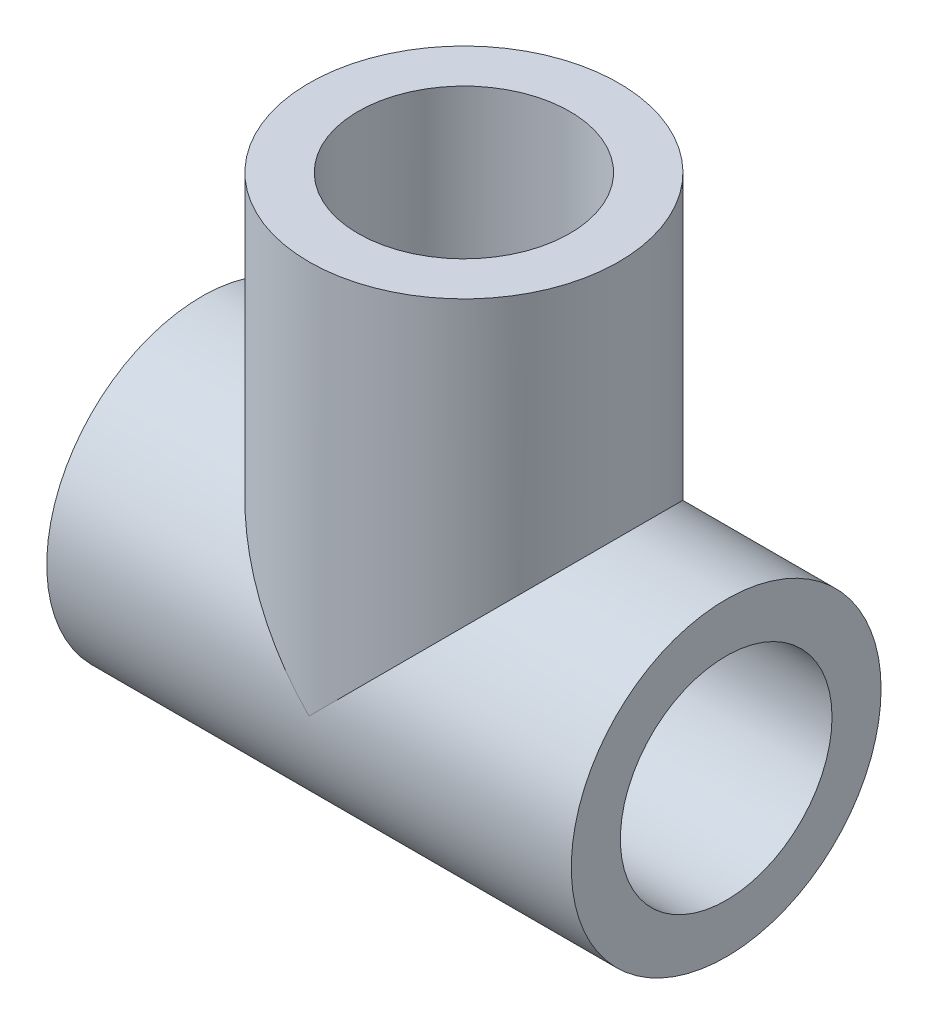
ISO-10303-21;
HEADER;
FILE_DESCRIPTION(('STEP AP214'),'2;1');
FILE_NAME('part.step','',(''),(''),'','','');
FILE_SCHEMA(('AUTOMOTIVE_DESIGN { 1 0 10303 214 1 1 1 1 }'));
ENDSEC;
DATA;
#1=APPLICATION_CONTEXT('core data for automotive mechanical design processes');
#2=APPLICATION_PROTOCOL_DEFINITION('international standard','automotive_design',2000,#1);
#3=PRODUCT_CONTEXT('',#1,'mechanical');
#4=PRODUCT('Part','Part','',(#3));
#5=PRODUCT_RELATED_PRODUCT_CATEGORY('part','',(#4));
#6=PRODUCT_DEFINITION_FORMATION('','',#4);
#7=PRODUCT_DEFINITION_CONTEXT('part definition',#1,'design');
#8=PRODUCT_DEFINITION('design','',#6,#7);
#9=PRODUCT_DEFINITION_SHAPE('','',#8);
#10=(LENGTH_UNIT() NAMED_UNIT(*) SI_UNIT(.MILLI.,.METRE.));
#11=(NAMED_UNIT(*) PLANE_ANGLE_UNIT() SI_UNIT($,.RADIAN.));
#12=(NAMED_UNIT(*) SI_UNIT($,.STERADIAN.) SOLID_ANGLE_UNIT());
#13=UNCERTAINTY_MEASURE_WITH_UNIT(LENGTH_MEASURE(1.E-05),#10,'distance_accuracy_value','');
#14=(GEOMETRIC_REPRESENTATION_CONTEXT(3) GLOBAL_UNCERTAINTY_ASSIGNED_CONTEXT((#13)) GLOBAL_UNIT_ASSIGNED_CONTEXT((#10,
#11,#12)) REPRESENTATION_CONTEXT('',''));
#15=CARTESIAN_POINT('',(0.,0.,0.));
#16=DIRECTION('',(0.,0.,1.));
#17=DIRECTION('',(1.,0.,0.));
#18=AXIS2_PLACEMENT_3D('',#15,#16,#17);
#19=CARTESIAN_POINT('',(25.4,0.,0.));
#20=DIRECTION('',(-1.,0.,0.));
#21=DIRECTION('',(0.,0.,1.));
#22=AXIS2_PLACEMENT_3D('',#19,#20,#21);
#23=CYLINDRICAL_SURFACE('',#22,7.5);
#24=CARTESIAN_POINT('',(0.,0.,0.));
#25=DIRECTION('',(1.,0.,0.));
#26=DIRECTION('',(0.,0.,-1.));
#27=AXIS2_PLACEMENT_3D('',#24,#25,#26);
#28=CIRCLE('',#27,7.5);
#29=CARTESIAN_POINT('',(0.,0.,-7.5));
#30=VERTEX_POINT('',#29);
#31=EDGE_CURVE('E89',#30,#30,#28,.T.);
#32=ORIENTED_EDGE('',*,*,#31,.T.);
#33=EDGE_LOOP('',(#32));
#34=FACE_BOUND('',#33,.T.);
#35=CARTESIAN_POINT('',(25.4,0.,0.));
#36=DIRECTION('',(1.,0.,0.));
#37=DIRECTION('',(0.,0.,-1.));
#38=AXIS2_PLACEMENT_3D('',#35,#36,#37);
#39=CIRCLE('',#38,7.5);
#40=CARTESIAN_POINT('',(25.4,0.,-7.5));
#41=VERTEX_POINT('',#40);
#42=EDGE_CURVE('E90',#41,#41,#39,.T.);
#43=ORIENTED_EDGE('',*,*,#42,.F.);
#44=EDGE_LOOP('',(#43));
#45=FACE_BOUND('',#44,.T.);
#46=CARTESIAN_POINT('',(12.7,0.,0.));
#47=DIRECTION('',(-0.707106781186548,-0.707106781186547,0.));
#48=DIRECTION('',(-0.707106781186548,0.707106781186547,0.));
#49=AXIS2_PLACEMENT_3D('',#46,#47,#48);
#50=ELLIPSE('',#49,10.6066017177982,7.5);
#51=CARTESIAN_POINT('',(12.7,0.,-7.5));
#52=VERTEX_POINT('',#51);
#53=CARTESIAN_POINT('',(12.7,0.,7.5));
#54=VERTEX_POINT('',#53);
#55=EDGE_CURVE('E11',#52,#54,#50,.F.);
#56=ORIENTED_EDGE('',*,*,#55,.F.);
#57=CARTESIAN_POINT('',(12.7,0.,0.));
#58=DIRECTION('',(-0.707106781186548,0.707106781186547,0.));
#59=DIRECTION('',(-0.707106781186548,-0.707106781186547,0.));
#60=AXIS2_PLACEMENT_3D('',#57,#58,#59);
#61=ELLIPSE('',#60,10.6066017177982,7.5);
#62=EDGE_CURVE('E47',#54,#52,#61,.T.);
#63=ORIENTED_EDGE('',*,*,#62,.F.);
#64=EDGE_LOOP('',(#56,#63));
#65=FACE_BOUND('',#64,.T.);
#66=ADVANCED_FACE('F39',(#34,#45,#65),#23,.T.);
#67=CARTESIAN_POINT('',(25.4,0.,0.));
#68=DIRECTION('',(1.,0.,0.));
#69=DIRECTION('',(0.,0.,-1.));
#70=AXIS2_PLACEMENT_3D('',#67,#68,#69);
#71=PLANE('',#70);
#72=CARTESIAN_POINT('',(25.4,0.,0.));
#73=DIRECTION('',(1.,0.,0.));
#74=DIRECTION('',(0.,0.,-1.));
#75=AXIS2_PLACEMENT_3D('',#72,#73,#74);
#76=CIRCLE('',#75,5.125);
#77=CARTESIAN_POINT('',(25.4,0.,-5.125));
#78=VERTEX_POINT('',#77);
#79=EDGE_CURVE('E75',#78,#78,#76,.T.);
#80=ORIENTED_EDGE('',*,*,#79,.F.);
#81=EDGE_LOOP('',(#80));
#82=FACE_BOUND('',#81,.T.);
#83=ORIENTED_EDGE('',*,*,#42,.T.);
#84=EDGE_LOOP('',(#83));
#85=FACE_BOUND('',#84,.T.);
#86=ADVANCED_FACE('F100',(#82,#85),#71,.T.);
#87=CARTESIAN_POINT('',(0.,0.,0.));
#88=DIRECTION('',(1.,0.,0.));
#89=DIRECTION('',(0.,0.,-1.));
#90=AXIS2_PLACEMENT_3D('',#87,#88,#89);
#91=PLANE('',#90);
#92=CARTESIAN_POINT('',(0.,0.,0.));
#93=DIRECTION('',(1.,0.,0.));
#94=DIRECTION('',(0.,0.,-1.));
#95=AXIS2_PLACEMENT_3D('',#92,#93,#94);
#96=CIRCLE('',#95,5.125);
#97=CARTESIAN_POINT('',(0.,0.,-5.125));
#98=VERTEX_POINT('',#97);
#99=EDGE_CURVE('E78',#98,#98,#96,.T.);
#100=ORIENTED_EDGE('',*,*,#99,.T.);
#101=EDGE_LOOP('',(#100));
#102=FACE_BOUND('',#101,.T.);
#103=ORIENTED_EDGE('',*,*,#31,.F.);
#104=EDGE_LOOP('',(#103));
#105=FACE_BOUND('',#104,.T.);
#106=ADVANCED_FACE('F105',(#102,#105),#91,.F.);
#107=CARTESIAN_POINT('',(12.7,19.05,0.));
#108=DIRECTION('',(0.,-1.,0.));
#109=DIRECTION('',(0.,0.,-1.));
#110=AXIS2_PLACEMENT_3D('',#107,#108,#109);
#111=CYLINDRICAL_SURFACE('',#110,7.5);
#112=CARTESIAN_POINT('',(12.7,19.05,0.));
#113=DIRECTION('',(0.,1.,0.));
#114=DIRECTION('',(0.,0.,1.));
#115=AXIS2_PLACEMENT_3D('',#112,#113,#114);
#116=CIRCLE('',#115,7.5);
#117=CARTESIAN_POINT('',(12.7,19.05,7.5));
#118=VERTEX_POINT('',#117);
#119=EDGE_CURVE('E82',#118,#118,#116,.T.);
#120=ORIENTED_EDGE('',*,*,#119,.F.);
#121=EDGE_LOOP('',(#120));
#122=FACE_BOUND('',#121,.T.);
#123=ORIENTED_EDGE('',*,*,#62,.T.);
#124=ORIENTED_EDGE('',*,*,#55,.T.);
#125=EDGE_LOOP('',(#123,#124));
#126=FACE_BOUND('',#125,.T.);
#127=ADVANCED_FACE('F98',(#122,#126),#111,.T.);
#128=CARTESIAN_POINT('',(12.7,19.05,0.));
#129=DIRECTION('',(0.,1.,0.));
#130=DIRECTION('',(0.,0.,1.));
#131=AXIS2_PLACEMENT_3D('',#128,#129,#130);
#132=PLANE('',#131);
#133=CARTESIAN_POINT('',(12.7,19.05,0.));
#134=DIRECTION('',(0.,1.,0.));
#135=DIRECTION('',(0.,0.,1.));
#136=AXIS2_PLACEMENT_3D('',#133,#134,#135);
#137=CIRCLE('',#136,5.12499999999999);
#138=CARTESIAN_POINT('',(12.7,19.05,5.12499999999999));
#139=VERTEX_POINT('',#138);
#140=EDGE_CURVE('E71',#139,#139,#137,.T.);
#141=ORIENTED_EDGE('',*,*,#140,.F.);
#142=EDGE_LOOP('',(#141));
#143=FACE_BOUND('',#142,.T.);
#144=ORIENTED_EDGE('',*,*,#119,.T.);
#145=EDGE_LOOP('',(#144));
#146=FACE_BOUND('',#145,.T.);
#147=ADVANCED_FACE('F118',(#143,#146),#132,.T.);
#148=CARTESIAN_POINT('',(0.,0.,0.));
#149=DIRECTION('',(1.,0.,0.));
#150=DIRECTION('',(0.,0.,-1.));
#151=AXIS2_PLACEMENT_3D('',#148,#149,#150);
#152=CYLINDRICAL_SURFACE('',#151,5.125);
#153=CARTESIAN_POINT('',(12.7,0.,0.));
#154=DIRECTION('',(-0.707106781186547,0.707106781186547,0.));
#155=DIRECTION('',(0.707106781186547,0.707106781186547,0.));
#156=AXIS2_PLACEMENT_3D('',#153,#154,#155);
#157=ELLIPSE('',#156,7.24784450716211,5.125);
#158=CARTESIAN_POINT('',(12.7,0.,-5.125));
#159=VERTEX_POINT('',#158);
#160=CARTESIAN_POINT('',(12.7,0.,5.125));
#161=VERTEX_POINT('',#160);
#162=EDGE_CURVE('E63',#159,#161,#157,.F.);
#163=ORIENTED_EDGE('',*,*,#162,.F.);
#164=CARTESIAN_POINT('',(12.7,0.,0.));
#165=DIRECTION('',(0.707106781186547,0.707106781186547,0.));
#166=DIRECTION('',(-0.707106781186547,0.707106781186547,0.));
#167=AXIS2_PLACEMENT_3D('',#164,#165,#166);
#168=ELLIPSE('',#167,7.24784450716211,5.125);
#169=EDGE_CURVE('E53',#161,#159,#168,.F.);
#170=ORIENTED_EDGE('',*,*,#169,.F.);
#171=EDGE_LOOP('',(#163,#170));
#172=FACE_BOUND('',#171,.T.);
#173=ORIENTED_EDGE('',*,*,#99,.F.);
#174=EDGE_LOOP('',(#173));
#175=FACE_BOUND('',#174,.T.);
#176=ORIENTED_EDGE('',*,*,#79,.T.);
#177=EDGE_LOOP('',(#176));
#178=FACE_BOUND('',#177,.T.);
#179=ADVANCED_FACE('F68',(#172,#175,#178),#152,.F.);
#180=CARTESIAN_POINT('',(12.7,-7.501,0.));
#181=DIRECTION('',(0.,1.,0.));
#182=DIRECTION('',(0.,0.,1.));
#183=AXIS2_PLACEMENT_3D('',#180,#181,#182);
#184=CYLINDRICAL_SURFACE('',#183,5.12499999999999);
#185=ORIENTED_EDGE('',*,*,#140,.T.);
#186=EDGE_LOOP('',(#185));
#187=FACE_BOUND('',#186,.T.);
#188=ORIENTED_EDGE('',*,*,#169,.T.);
#189=ORIENTED_EDGE('',*,*,#162,.T.);
#190=EDGE_LOOP('',(#188,#189));
#191=FACE_BOUND('',#190,.T.);
#192=ADVANCED_FACE('F64',(#187,#191),#184,.F.);
#193=CLOSED_SHELL('',(#66,#86,#106,#127,#147,#179,#192));
#194=MANIFOLD_SOLID_BREP('B2',#193);
#195=ADVANCED_BREP_SHAPE_REPRESENTATION('',(#18,#194),#14);
#196=SHAPE_DEFINITION_REPRESENTATION(#9,#195);
ENDSEC;
END-ISO-10303-21;
